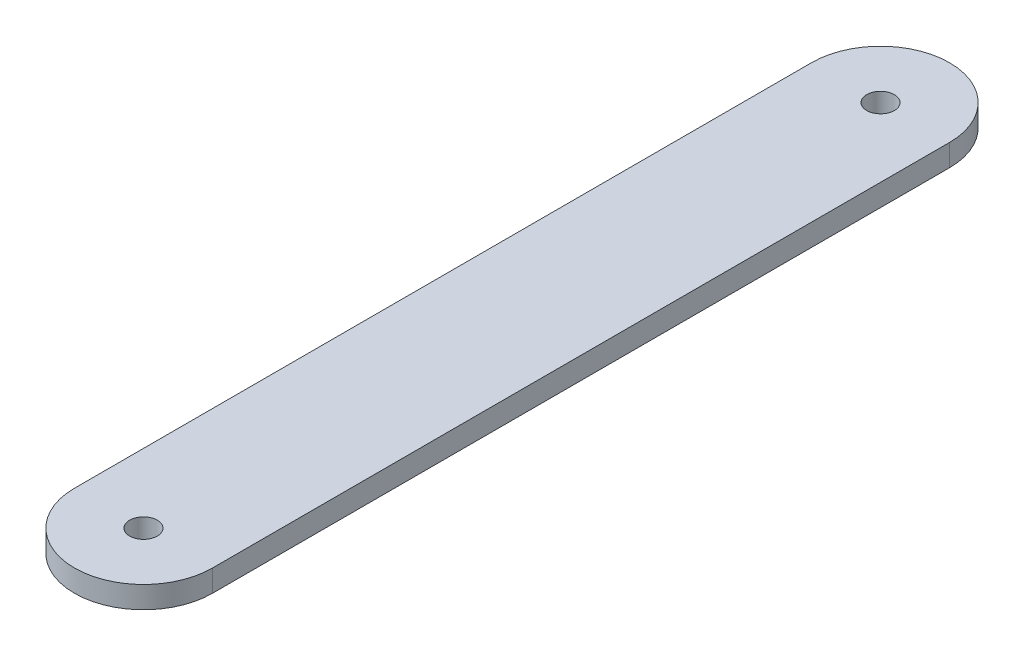
ISO-10303-21;
HEADER;
FILE_DESCRIPTION(('STEP AP214'),'2;1');
FILE_NAME('part.step','',(''),(''),'','','');
FILE_SCHEMA(('AUTOMOTIVE_DESIGN { 1 0 10303 214 1 1 1 1 }'));
ENDSEC;
DATA;
#1=APPLICATION_CONTEXT('core data for automotive mechanical design processes');
#2=APPLICATION_PROTOCOL_DEFINITION('international standard','automotive_design',2000,#1);
#3=PRODUCT_CONTEXT('',#1,'mechanical');
#4=PRODUCT('Part','Part','',(#3));
#5=PRODUCT_RELATED_PRODUCT_CATEGORY('part','',(#4));
#6=PRODUCT_DEFINITION_FORMATION('','',#4);
#7=PRODUCT_DEFINITION_CONTEXT('part definition',#1,'design');
#8=PRODUCT_DEFINITION('design','',#6,#7);
#9=PRODUCT_DEFINITION_SHAPE('','',#8);
#10=(LENGTH_UNIT() NAMED_UNIT(*) SI_UNIT(.MILLI.,.METRE.));
#11=(NAMED_UNIT(*) PLANE_ANGLE_UNIT() SI_UNIT($,.RADIAN.));
#12=(NAMED_UNIT(*) SI_UNIT($,.STERADIAN.) SOLID_ANGLE_UNIT());
#13=UNCERTAINTY_MEASURE_WITH_UNIT(LENGTH_MEASURE(1.E-05),#10,'distance_accuracy_value','');
#14=(GEOMETRIC_REPRESENTATION_CONTEXT(3) GLOBAL_UNCERTAINTY_ASSIGNED_CONTEXT((#13)) GLOBAL_UNIT_ASSIGNED_CONTEXT((#10,
#11,#12)) REPRESENTATION_CONTEXT('',''));
#15=CARTESIAN_POINT('',(0.,0.,0.));
#16=DIRECTION('',(0.,0.,1.));
#17=DIRECTION('',(1.,0.,0.));
#18=AXIS2_PLACEMENT_3D('',#15,#16,#17);
#19=CARTESIAN_POINT('',(0.,1.5875,0.));
#20=DIRECTION('',(0.,-1.,0.));
#21=DIRECTION('',(0.,0.,-1.));
#22=AXIS2_PLACEMENT_3D('',#19,#20,#21);
#23=PLANE('',#22);
#24=CARTESIAN_POINT('',(0.,1.5875,0.));
#25=DIRECTION('',(0.,1.,0.));
#26=DIRECTION('',(0.,0.,-1.));
#27=AXIS2_PLACEMENT_3D('',#24,#25,#26);
#28=CIRCLE('',#27,5.);
#29=CARTESIAN_POINT('',(-5.,1.5875,0.));
#30=VERTEX_POINT('',#29);
#31=CARTESIAN_POINT('',(5.,1.5875,0.));
#32=VERTEX_POINT('',#31);
#33=EDGE_CURVE('E98',#30,#32,#28,.T.);
#34=ORIENTED_EDGE('',*,*,#33,.T.);
#35=DIRECTION('',(0.,0.,-1.));
#36=VECTOR('',#35,1.);
#37=CARTESIAN_POINT('',(5.00000000000001,1.5875,-53.3739));
#38=LINE('',#37,#36);
#39=CARTESIAN_POINT('',(5.00000000000001,1.5875,-53.3739));
#40=VERTEX_POINT('',#39);
#41=EDGE_CURVE('E93',#32,#40,#38,.T.);
#42=ORIENTED_EDGE('',*,*,#41,.T.);
#43=CARTESIAN_POINT('',(0.,1.5875,-53.3739));
#44=DIRECTION('',(0.,1.,0.));
#45=DIRECTION('',(0.,0.,1.));
#46=AXIS2_PLACEMENT_3D('',#43,#44,#45);
#47=CIRCLE('',#46,5.00000000000001);
#48=CARTESIAN_POINT('',(-5.00000000000001,1.5875,-53.3739));
#49=VERTEX_POINT('',#48);
#50=EDGE_CURVE('E96',#40,#49,#47,.T.);
#51=ORIENTED_EDGE('',*,*,#50,.T.);
#52=DIRECTION('',(0.,0.,1.));
#53=VECTOR('',#52,1.);
#54=CARTESIAN_POINT('',(-5.00000000000001,1.5875,-53.3739));
#55=LINE('',#54,#53);
#56=EDGE_CURVE('E63',#49,#30,#55,.T.);
#57=ORIENTED_EDGE('',*,*,#56,.T.);
#58=EDGE_LOOP('',(#34,#42,#51,#57));
#59=FACE_BOUND('',#58,.T.);
#60=CARTESIAN_POINT('',(0.,1.5875,0.));
#61=DIRECTION('',(0.,1.,0.));
#62=DIRECTION('',(0.,0.,1.));
#63=AXIS2_PLACEMENT_3D('',#60,#61,#62);
#64=CIRCLE('',#63,1.);
#65=CARTESIAN_POINT('',(0.,1.5875,1.));
#66=VERTEX_POINT('',#65);
#67=EDGE_CURVE('E118',#66,#66,#64,.T.);
#68=ORIENTED_EDGE('',*,*,#67,.F.);
#69=EDGE_LOOP('',(#68));
#70=FACE_BOUND('',#69,.T.);
#71=CARTESIAN_POINT('',(0.,1.5875,-53.3739));
#72=DIRECTION('',(0.,1.,0.));
#73=DIRECTION('',(0.,0.,1.));
#74=AXIS2_PLACEMENT_3D('',#71,#72,#73);
#75=CIRCLE('',#74,1.);
#76=CARTESIAN_POINT('',(0.,1.5875,-52.3739));
#77=VERTEX_POINT('',#76);
#78=EDGE_CURVE('E140',#77,#77,#75,.T.);
#79=ORIENTED_EDGE('',*,*,#78,.F.);
#80=EDGE_LOOP('',(#79));
#81=FACE_BOUND('',#80,.T.);
#82=ADVANCED_FACE('F45',(#59,#70,#81),#23,.F.);
#83=CARTESIAN_POINT('',(0.,0.,0.));
#84=DIRECTION('',(0.,-1.,0.));
#85=DIRECTION('',(0.,0.,-1.));
#86=AXIS2_PLACEMENT_3D('',#83,#84,#85);
#87=PLANE('',#86);
#88=CARTESIAN_POINT('',(0.,0.,0.));
#89=DIRECTION('',(0.,1.,0.));
#90=DIRECTION('',(0.,0.,1.));
#91=AXIS2_PLACEMENT_3D('',#88,#89,#90);
#92=CIRCLE('',#91,1.);
#93=CARTESIAN_POINT('',(0.,0.,1.));
#94=VERTEX_POINT('',#93);
#95=EDGE_CURVE('E136',#94,#94,#92,.T.);
#96=ORIENTED_EDGE('',*,*,#95,.T.);
#97=EDGE_LOOP('',(#96));
#98=FACE_BOUND('',#97,.T.);
#99=CARTESIAN_POINT('',(0.,0.,0.));
#100=DIRECTION('',(0.,1.,0.));
#101=DIRECTION('',(0.,0.,-1.));
#102=AXIS2_PLACEMENT_3D('',#99,#100,#101);
#103=CIRCLE('',#102,5.);
#104=CARTESIAN_POINT('',(-5.,0.,0.));
#105=VERTEX_POINT('',#104);
#106=CARTESIAN_POINT('',(5.,0.,0.));
#107=VERTEX_POINT('',#106);
#108=EDGE_CURVE('E114',#105,#107,#103,.T.);
#109=ORIENTED_EDGE('',*,*,#108,.F.);
#110=DIRECTION('',(0.,0.,1.));
#111=VECTOR('',#110,1.);
#112=CARTESIAN_POINT('',(-5.00000000000001,0.,-53.3739));
#113=LINE('',#112,#111);
#114=CARTESIAN_POINT('',(-5.00000000000001,0.,-53.3739));
#115=VERTEX_POINT('',#114);
#116=EDGE_CURVE('E86',#115,#105,#113,.T.);
#117=ORIENTED_EDGE('',*,*,#116,.F.);
#118=CARTESIAN_POINT('',(0.,0.,-53.3739));
#119=DIRECTION('',(0.,1.,0.));
#120=DIRECTION('',(0.,0.,1.));
#121=AXIS2_PLACEMENT_3D('',#118,#119,#120);
#122=CIRCLE('',#121,5.00000000000001);
#123=CARTESIAN_POINT('',(5.00000000000001,0.,-53.3739));
#124=VERTEX_POINT('',#123);
#125=EDGE_CURVE('E80',#124,#115,#122,.T.);
#126=ORIENTED_EDGE('',*,*,#125,.F.);
#127=DIRECTION('',(0.,0.,-1.));
#128=VECTOR('',#127,1.);
#129=CARTESIAN_POINT('',(5.00000000000001,0.,-53.3739));
#130=LINE('',#129,#128);
#131=EDGE_CURVE('E103',#107,#124,#130,.T.);
#132=ORIENTED_EDGE('',*,*,#131,.F.);
#133=EDGE_LOOP('',(#109,#117,#126,#132));
#134=FACE_BOUND('',#133,.T.);
#135=CARTESIAN_POINT('',(0.,0.,-53.3739));
#136=DIRECTION('',(0.,1.,0.));
#137=DIRECTION('',(0.,0.,1.));
#138=AXIS2_PLACEMENT_3D('',#135,#136,#137);
#139=CIRCLE('',#138,1.);
#140=CARTESIAN_POINT('',(0.,0.,-52.3739));
#141=VERTEX_POINT('',#140);
#142=EDGE_CURVE('E144',#141,#141,#139,.T.);
#143=ORIENTED_EDGE('',*,*,#142,.T.);
#144=EDGE_LOOP('',(#143));
#145=FACE_BOUND('',#144,.T.);
#146=ADVANCED_FACE('F131',(#98,#134,#145),#87,.T.);
#147=CARTESIAN_POINT('',(0.,1.5875,0.));
#148=DIRECTION('',(0.,-1.,0.));
#149=DIRECTION('',(0.,0.,-1.));
#150=AXIS2_PLACEMENT_3D('',#147,#148,#149);
#151=CYLINDRICAL_SURFACE('',#150,5.);
#152=ORIENTED_EDGE('',*,*,#108,.T.);
#153=DIRECTION('',(0.,-1.,0.));
#154=VECTOR('',#153,1.);
#155=CARTESIAN_POINT('',(5.,1.5875,0.));
#156=LINE('',#155,#154);
#157=EDGE_CURVE('E11',#32,#107,#156,.T.);
#158=ORIENTED_EDGE('',*,*,#157,.F.);
#159=ORIENTED_EDGE('',*,*,#33,.F.);
#160=DIRECTION('',(0.,-1.,0.));
#161=VECTOR('',#160,1.);
#162=CARTESIAN_POINT('',(-5.,1.5875,0.));
#163=LINE('',#162,#161);
#164=EDGE_CURVE('E110',#30,#105,#163,.T.);
#165=ORIENTED_EDGE('',*,*,#164,.T.);
#166=EDGE_LOOP('',(#152,#158,#159,#165));
#167=FACE_BOUND('',#166,.T.);
#168=ADVANCED_FACE('F47',(#167),#151,.T.);
#169=CARTESIAN_POINT('',(5.00000000000001,1.5875,-53.3739));
#170=DIRECTION('',(-1.,0.,0.));
#171=DIRECTION('',(0.,0.,1.));
#172=AXIS2_PLACEMENT_3D('',#169,#170,#171);
#173=PLANE('',#172);
#174=ORIENTED_EDGE('',*,*,#131,.T.);
#175=DIRECTION('',(0.,-1.,0.));
#176=VECTOR('',#175,1.);
#177=CARTESIAN_POINT('',(5.00000000000001,1.5875,-53.3739));
#178=LINE('',#177,#176);
#179=EDGE_CURVE('E55',#40,#124,#178,.T.);
#180=ORIENTED_EDGE('',*,*,#179,.F.);
#181=ORIENTED_EDGE('',*,*,#41,.F.);
#182=ORIENTED_EDGE('',*,*,#157,.T.);
#183=EDGE_LOOP('',(#174,#180,#181,#182));
#184=FACE_BOUND('',#183,.T.);
#185=ADVANCED_FACE('F102',(#184),#173,.F.);
#186=CARTESIAN_POINT('',(0.,1.5875,-53.3739));
#187=DIRECTION('',(0.,-1.,0.));
#188=DIRECTION('',(0.,0.,-1.));
#189=AXIS2_PLACEMENT_3D('',#186,#187,#188);
#190=CYLINDRICAL_SURFACE('',#189,5.00000000000001);
#191=ORIENTED_EDGE('',*,*,#125,.T.);
#192=DIRECTION('',(0.,-1.,0.));
#193=VECTOR('',#192,1.);
#194=CARTESIAN_POINT('',(-5.00000000000001,1.5875,-53.3739));
#195=LINE('',#194,#193);
#196=EDGE_CURVE('E105',#49,#115,#195,.T.);
#197=ORIENTED_EDGE('',*,*,#196,.F.);
#198=ORIENTED_EDGE('',*,*,#50,.F.);
#199=ORIENTED_EDGE('',*,*,#179,.T.);
#200=EDGE_LOOP('',(#191,#197,#198,#199));
#201=FACE_BOUND('',#200,.T.);
#202=ADVANCED_FACE('F106',(#201),#190,.T.);
#203=CARTESIAN_POINT('',(-5.00000000000001,1.5875,-53.3739));
#204=DIRECTION('',(1.,0.,0.));
#205=DIRECTION('',(0.,0.,-1.));
#206=AXIS2_PLACEMENT_3D('',#203,#204,#205);
#207=PLANE('',#206);
#208=ORIENTED_EDGE('',*,*,#116,.T.);
#209=ORIENTED_EDGE('',*,*,#164,.F.);
#210=ORIENTED_EDGE('',*,*,#56,.F.);
#211=ORIENTED_EDGE('',*,*,#196,.T.);
#212=EDGE_LOOP('',(#208,#209,#210,#211));
#213=FACE_BOUND('',#212,.T.);
#214=ADVANCED_FACE('F128',(#213),#207,.F.);
#215=CARTESIAN_POINT('',(0.,1.5875,0.));
#216=DIRECTION('',(0.,-1.,0.));
#217=DIRECTION('',(0.,0.,-1.));
#218=AXIS2_PLACEMENT_3D('',#215,#216,#217);
#219=CYLINDRICAL_SURFACE('',#218,1.);
#220=ORIENTED_EDGE('',*,*,#67,.T.);
#221=EDGE_LOOP('',(#220));
#222=FACE_BOUND('',#221,.T.);
#223=ORIENTED_EDGE('',*,*,#95,.F.);
#224=EDGE_LOOP('',(#223));
#225=FACE_BOUND('',#224,.T.);
#226=ADVANCED_FACE('F163',(#222,#225),#219,.F.);
#227=CARTESIAN_POINT('',(0.,1.5875,-53.3739));
#228=DIRECTION('',(0.,-1.,0.));
#229=DIRECTION('',(0.,0.,-1.));
#230=AXIS2_PLACEMENT_3D('',#227,#228,#229);
#231=CYLINDRICAL_SURFACE('',#230,1.);
#232=ORIENTED_EDGE('',*,*,#78,.T.);
#233=EDGE_LOOP('',(#232));
#234=FACE_BOUND('',#233,.T.);
#235=ORIENTED_EDGE('',*,*,#142,.F.);
#236=EDGE_LOOP('',(#235));
#237=FACE_BOUND('',#236,.T.);
#238=ADVANCED_FACE('F152',(#234,#237),#231,.F.);
#239=CLOSED_SHELL('',(#82,#146,#168,#185,#202,#214,#226,#238));
#240=MANIFOLD_SOLID_BREP('B2',#239);
#241=ADVANCED_BREP_SHAPE_REPRESENTATION('',(#18,#240),#14);
#242=SHAPE_DEFINITION_REPRESENTATION(#9,#241);
ENDSEC;
END-ISO-10303-21;
